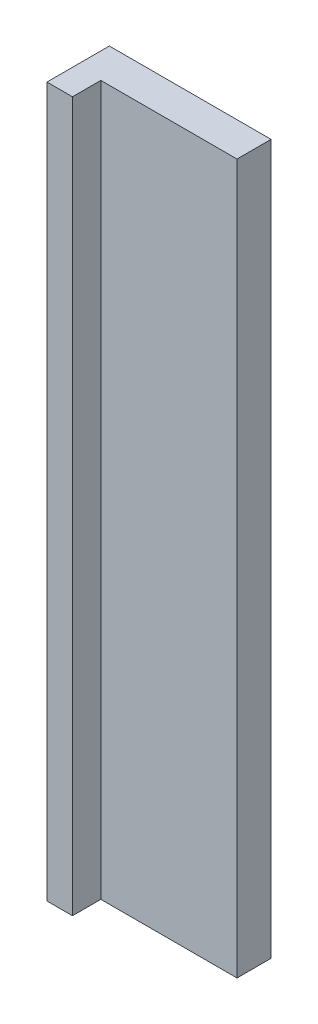
ISO-10303-21;
HEADER;
FILE_DESCRIPTION(('STEP AP214'),'2;1');
FILE_NAME('part.step','',(''),(''),'','','');
FILE_SCHEMA(('AUTOMOTIVE_DESIGN { 1 0 10303 214 1 1 1 1 }'));
ENDSEC;
DATA;
#1=APPLICATION_CONTEXT('core data for automotive mechanical design processes');
#2=APPLICATION_PROTOCOL_DEFINITION('international standard','automotive_design',2000,#1);
#3=PRODUCT_CONTEXT('',#1,'mechanical');
#4=PRODUCT('Part','Part','',(#3));
#5=PRODUCT_RELATED_PRODUCT_CATEGORY('part','',(#4));
#6=PRODUCT_DEFINITION_FORMATION('','',#4);
#7=PRODUCT_DEFINITION_CONTEXT('part definition',#1,'design');
#8=PRODUCT_DEFINITION('design','',#6,#7);
#9=PRODUCT_DEFINITION_SHAPE('','',#8);
#10=(LENGTH_UNIT() NAMED_UNIT(*) SI_UNIT(.MILLI.,.METRE.));
#11=(NAMED_UNIT(*) PLANE_ANGLE_UNIT() SI_UNIT($,.RADIAN.));
#12=(NAMED_UNIT(*) SI_UNIT($,.STERADIAN.) SOLID_ANGLE_UNIT());
#13=UNCERTAINTY_MEASURE_WITH_UNIT(LENGTH_MEASURE(1.E-05),#10,'distance_accuracy_value','');
#14=(GEOMETRIC_REPRESENTATION_CONTEXT(3) GLOBAL_UNCERTAINTY_ASSIGNED_CONTEXT((#13)) GLOBAL_UNIT_ASSIGNED_CONTEXT((#10,
#11,#12)) REPRESENTATION_CONTEXT('',''));
#15=CARTESIAN_POINT('',(0.,0.,0.));
#16=DIRECTION('',(0.,0.,1.));
#17=DIRECTION('',(1.,0.,0.));
#18=AXIS2_PLACEMENT_3D('',#15,#16,#17);
#19=CARTESIAN_POINT('',(0.,0.,6.));
#20=DIRECTION('',(0.,0.,-1.));
#21=DIRECTION('',(-1.,0.,0.));
#22=AXIS2_PLACEMENT_3D('',#19,#20,#21);
#23=PLANE('',#22);
#24=DIRECTION('',(0.,1.,0.));
#25=VECTOR('',#24,1.);
#26=CARTESIAN_POINT('',(4.5,0.,6.));
#27=LINE('',#26,#25);
#28=CARTESIAN_POINT('',(4.5,0.,6.));
#29=VERTEX_POINT('',#28);
#30=CARTESIAN_POINT('',(4.5,125.,6.));
#31=VERTEX_POINT('',#30);
#32=EDGE_CURVE('E48',#29,#31,#27,.T.);
#33=ORIENTED_EDGE('',*,*,#32,.F.);
#34=DIRECTION('',(1.,0.,0.));
#35=VECTOR('',#34,1.);
#36=CARTESIAN_POINT('',(0.,0.,6.));
#37=LINE('',#36,#35);
#38=CARTESIAN_POINT('',(28.5,0.,6.));
#39=VERTEX_POINT('',#38);
#40=EDGE_CURVE('E85',#29,#39,#37,.T.);
#41=ORIENTED_EDGE('',*,*,#40,.T.);
#42=DIRECTION('',(0.,1.,0.));
#43=VECTOR('',#42,1.);
#44=CARTESIAN_POINT('',(28.5,0.,6.));
#45=LINE('',#44,#43);
#46=CARTESIAN_POINT('',(28.5,125.,6.));
#47=VERTEX_POINT('',#46);
#48=EDGE_CURVE('E54',#39,#47,#45,.T.);
#49=ORIENTED_EDGE('',*,*,#48,.T.);
#50=DIRECTION('',(-1.,0.,0.));
#51=VECTOR('',#50,1.);
#52=CARTESIAN_POINT('',(0.,125.,6.));
#53=LINE('',#52,#51);
#54=EDGE_CURVE('E95',#47,#31,#53,.T.);
#55=ORIENTED_EDGE('',*,*,#54,.T.);
#56=EDGE_LOOP('',(#33,#41,#49,#55));
#57=FACE_BOUND('',#56,.T.);
#58=ADVANCED_FACE('F33',(#57),#23,.F.);
#59=CARTESIAN_POINT('',(0.,0.,6.));
#60=DIRECTION('',(1.,0.,0.));
#61=DIRECTION('',(0.,0.,-1.));
#62=AXIS2_PLACEMENT_3D('',#59,#60,#61);
#63=PLANE('',#62);
#64=DIRECTION('',(0.,-1.,0.));
#65=VECTOR('',#64,1.);
#66=CARTESIAN_POINT('',(0.,0.,0.));
#67=LINE('',#66,#65);
#68=CARTESIAN_POINT('',(0.,125.,0.));
#69=VERTEX_POINT('',#68);
#70=CARTESIAN_POINT('',(0.,0.,0.));
#71=VERTEX_POINT('',#70);
#72=EDGE_CURVE('E92',#69,#71,#67,.T.);
#73=ORIENTED_EDGE('',*,*,#72,.T.);
#74=DIRECTION('',(0.,0.,-1.));
#75=VECTOR('',#74,1.);
#76=CARTESIAN_POINT('',(0.,0.,6.));
#77=LINE('',#76,#75);
#78=CARTESIAN_POINT('',(0.,0.,11.));
#79=VERTEX_POINT('',#78);
#80=EDGE_CURVE('E11',#79,#71,#77,.T.);
#81=ORIENTED_EDGE('',*,*,#80,.F.);
#82=DIRECTION('',(0.,-1.,0.));
#83=VECTOR('',#82,1.);
#84=CARTESIAN_POINT('',(0.,0.,11.));
#85=LINE('',#84,#83);
#86=CARTESIAN_POINT('',(0.,125.,11.));
#87=VERTEX_POINT('',#86);
#88=EDGE_CURVE('E94',#87,#79,#85,.T.);
#89=ORIENTED_EDGE('',*,*,#88,.F.);
#90=DIRECTION('',(0.,0.,-1.));
#91=VECTOR('',#90,1.);
#92=CARTESIAN_POINT('',(0.,125.,6.));
#93=LINE('',#92,#91);
#94=EDGE_CURVE('E78',#87,#69,#93,.T.);
#95=ORIENTED_EDGE('',*,*,#94,.T.);
#96=EDGE_LOOP('',(#73,#81,#89,#95));
#97=FACE_BOUND('',#96,.T.);
#98=ADVANCED_FACE('F35',(#97),#63,.F.);
#99=CARTESIAN_POINT('',(0.,0.,6.));
#100=DIRECTION('',(0.,1.,0.));
#101=DIRECTION('',(0.,0.,1.));
#102=AXIS2_PLACEMENT_3D('',#99,#100,#101);
#103=PLANE('',#102);
#104=DIRECTION('',(1.,0.,0.));
#105=VECTOR('',#104,1.);
#106=CARTESIAN_POINT('',(0.,0.,0.));
#107=LINE('',#106,#105);
#108=CARTESIAN_POINT('',(28.5,0.,0.));
#109=VERTEX_POINT('',#108);
#110=EDGE_CURVE('E98',#71,#109,#107,.T.);
#111=ORIENTED_EDGE('',*,*,#110,.T.);
#112=DIRECTION('',(0.,0.,-1.));
#113=VECTOR('',#112,1.);
#114=CARTESIAN_POINT('',(28.5,0.,6.));
#115=LINE('',#114,#113);
#116=EDGE_CURVE('E41',#39,#109,#115,.T.);
#117=ORIENTED_EDGE('',*,*,#116,.F.);
#118=ORIENTED_EDGE('',*,*,#40,.F.);
#119=DIRECTION('',(0.,0.,-1.));
#120=VECTOR('',#119,1.);
#121=CARTESIAN_POINT('',(4.5,0.,11.));
#122=LINE('',#121,#120);
#123=CARTESIAN_POINT('',(4.5,0.,11.));
#124=VERTEX_POINT('',#123);
#125=EDGE_CURVE('E99',#124,#29,#122,.T.);
#126=ORIENTED_EDGE('',*,*,#125,.F.);
#127=DIRECTION('',(1.,0.,0.));
#128=VECTOR('',#127,1.);
#129=CARTESIAN_POINT('',(0.,0.,11.));
#130=LINE('',#129,#128);
#131=EDGE_CURVE('E119',#79,#124,#130,.T.);
#132=ORIENTED_EDGE('',*,*,#131,.F.);
#133=ORIENTED_EDGE('',*,*,#80,.T.);
#134=EDGE_LOOP('',(#111,#117,#118,#126,#132,#133));
#135=FACE_BOUND('',#134,.T.);
#136=ADVANCED_FACE('F114',(#135),#103,.F.);
#137=CARTESIAN_POINT('',(28.5,0.,6.));
#138=DIRECTION('',(-1.,0.,0.));
#139=DIRECTION('',(0.,0.,1.));
#140=AXIS2_PLACEMENT_3D('',#137,#138,#139);
#141=PLANE('',#140);
#142=DIRECTION('',(0.,1.,0.));
#143=VECTOR('',#142,1.);
#144=CARTESIAN_POINT('',(28.5,0.,0.));
#145=LINE('',#144,#143);
#146=CARTESIAN_POINT('',(28.5,125.,0.));
#147=VERTEX_POINT('',#146);
#148=EDGE_CURVE('E86',#109,#147,#145,.T.);
#149=ORIENTED_EDGE('',*,*,#148,.T.);
#150=DIRECTION('',(0.,0.,-1.));
#151=VECTOR('',#150,1.);
#152=CARTESIAN_POINT('',(28.5,125.,6.));
#153=LINE('',#152,#151);
#154=EDGE_CURVE('E81',#47,#147,#153,.T.);
#155=ORIENTED_EDGE('',*,*,#154,.F.);
#156=ORIENTED_EDGE('',*,*,#48,.F.);
#157=ORIENTED_EDGE('',*,*,#116,.T.);
#158=EDGE_LOOP('',(#149,#155,#156,#157));
#159=FACE_BOUND('',#158,.T.);
#160=ADVANCED_FACE('F112',(#159),#141,.F.);
#161=CARTESIAN_POINT('',(0.,125.,6.));
#162=DIRECTION('',(0.,-1.,0.));
#163=DIRECTION('',(0.,0.,-1.));
#164=AXIS2_PLACEMENT_3D('',#161,#162,#163);
#165=PLANE('',#164);
#166=DIRECTION('',(-1.,0.,0.));
#167=VECTOR('',#166,1.);
#168=CARTESIAN_POINT('',(0.,125.,0.));
#169=LINE('',#168,#167);
#170=EDGE_CURVE('E74',#147,#69,#169,.T.);
#171=ORIENTED_EDGE('',*,*,#170,.T.);
#172=ORIENTED_EDGE('',*,*,#94,.F.);
#173=DIRECTION('',(-1.,0.,0.));
#174=VECTOR('',#173,1.);
#175=CARTESIAN_POINT('',(0.,125.,11.));
#176=LINE('',#175,#174);
#177=CARTESIAN_POINT('',(4.5,125.,11.));
#178=VERTEX_POINT('',#177);
#179=EDGE_CURVE('E133',#178,#87,#176,.T.);
#180=ORIENTED_EDGE('',*,*,#179,.F.);
#181=DIRECTION('',(0.,0.,-1.));
#182=VECTOR('',#181,1.);
#183=CARTESIAN_POINT('',(4.5,125.,11.));
#184=LINE('',#183,#182);
#185=EDGE_CURVE('E103',#178,#31,#184,.T.);
#186=ORIENTED_EDGE('',*,*,#185,.T.);
#187=ORIENTED_EDGE('',*,*,#54,.F.);
#188=ORIENTED_EDGE('',*,*,#154,.T.);
#189=EDGE_LOOP('',(#171,#172,#180,#186,#187,#188));
#190=FACE_BOUND('',#189,.T.);
#191=ADVANCED_FACE('F76',(#190),#165,.F.);
#192=CARTESIAN_POINT('',(0.,0.,0.));
#193=DIRECTION('',(0.,0.,-1.));
#194=DIRECTION('',(-1.,0.,0.));
#195=AXIS2_PLACEMENT_3D('',#192,#193,#194);
#196=PLANE('',#195);
#197=ORIENTED_EDGE('',*,*,#72,.F.);
#198=ORIENTED_EDGE('',*,*,#170,.F.);
#199=ORIENTED_EDGE('',*,*,#148,.F.);
#200=ORIENTED_EDGE('',*,*,#110,.F.);
#201=EDGE_LOOP('',(#197,#198,#199,#200));
#202=FACE_BOUND('',#201,.T.);
#203=ADVANCED_FACE('F97',(#202),#196,.T.);
#204=CARTESIAN_POINT('',(4.5,0.,11.));
#205=DIRECTION('',(-1.,0.,0.));
#206=DIRECTION('',(0.,0.,1.));
#207=AXIS2_PLACEMENT_3D('',#204,#205,#206);
#208=PLANE('',#207);
#209=ORIENTED_EDGE('',*,*,#32,.T.);
#210=ORIENTED_EDGE('',*,*,#185,.F.);
#211=DIRECTION('',(0.,1.,0.));
#212=VECTOR('',#211,1.);
#213=CARTESIAN_POINT('',(4.5,0.,11.));
#214=LINE('',#213,#212);
#215=EDGE_CURVE('E130',#124,#178,#214,.T.);
#216=ORIENTED_EDGE('',*,*,#215,.F.);
#217=ORIENTED_EDGE('',*,*,#125,.T.);
#218=EDGE_LOOP('',(#209,#210,#216,#217));
#219=FACE_BOUND('',#218,.T.);
#220=ADVANCED_FACE('F137',(#219),#208,.F.);
#221=CARTESIAN_POINT('',(0.,0.,11.));
#222=DIRECTION('',(0.,0.,-1.));
#223=DIRECTION('',(-1.,0.,0.));
#224=AXIS2_PLACEMENT_3D('',#221,#222,#223);
#225=PLANE('',#224);
#226=ORIENTED_EDGE('',*,*,#88,.T.);
#227=ORIENTED_EDGE('',*,*,#131,.T.);
#228=ORIENTED_EDGE('',*,*,#215,.T.);
#229=ORIENTED_EDGE('',*,*,#179,.T.);
#230=EDGE_LOOP('',(#226,#227,#228,#229));
#231=FACE_BOUND('',#230,.T.);
#232=ADVANCED_FACE('F132',(#231),#225,.F.);
#233=CLOSED_SHELL('',(#58,#98,#136,#160,#191,#203,#220,#232));
#234=MANIFOLD_SOLID_BREP('B2',#233);
#235=ADVANCED_BREP_SHAPE_REPRESENTATION('',(#18,#234),#14);
#236=SHAPE_DEFINITION_REPRESENTATION(#9,#235);
ENDSEC;
END-ISO-10303-21;
